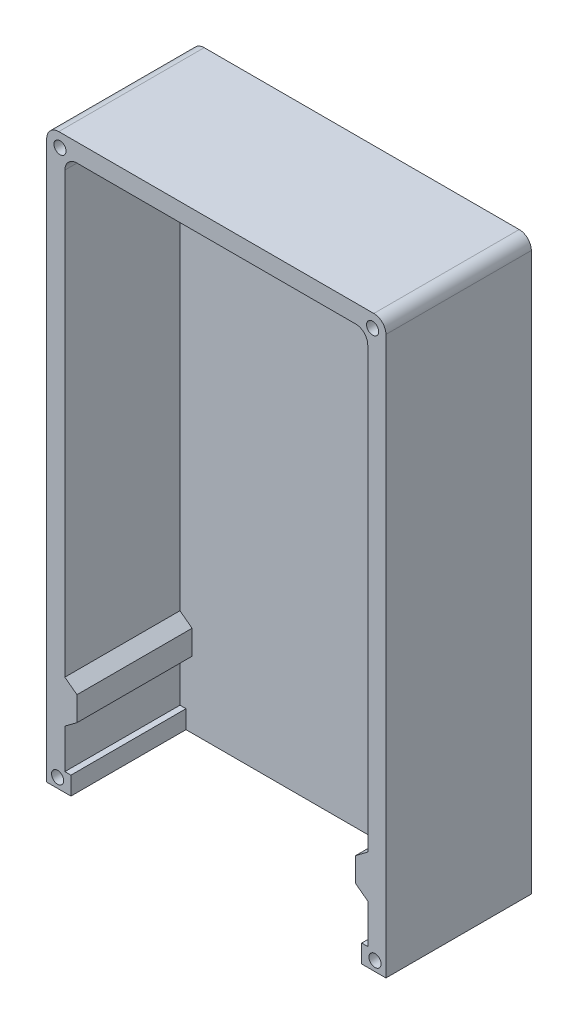
ISO-10303-21;
HEADER;
FILE_DESCRIPTION(('STEP AP214'),'2;1');
FILE_NAME('part.step','',(''),(''),'','','');
FILE_SCHEMA(('AUTOMOTIVE_DESIGN { 1 0 10303 214 1 1 1 1 }'));
ENDSEC;
DATA;
#1=APPLICATION_CONTEXT('core data for automotive mechanical design processes');
#2=APPLICATION_PROTOCOL_DEFINITION('international standard','automotive_design',2000,#1);
#3=PRODUCT_CONTEXT('',#1,'mechanical');
#4=PRODUCT('Part','Part','',(#3));
#5=PRODUCT_RELATED_PRODUCT_CATEGORY('part','',(#4));
#6=PRODUCT_DEFINITION_FORMATION('','',#4);
#7=PRODUCT_DEFINITION_CONTEXT('part definition',#1,'design');
#8=PRODUCT_DEFINITION('design','',#6,#7);
#9=PRODUCT_DEFINITION_SHAPE('','',#8);
#10=(LENGTH_UNIT() NAMED_UNIT(*) SI_UNIT(.MILLI.,.METRE.));
#11=(NAMED_UNIT(*) PLANE_ANGLE_UNIT() SI_UNIT($,.RADIAN.));
#12=(NAMED_UNIT(*) SI_UNIT($,.STERADIAN.) SOLID_ANGLE_UNIT());
#13=UNCERTAINTY_MEASURE_WITH_UNIT(LENGTH_MEASURE(1.E-05),#10,'distance_accuracy_value','');
#14=(GEOMETRIC_REPRESENTATION_CONTEXT(3) GLOBAL_UNCERTAINTY_ASSIGNED_CONTEXT((#13)) GLOBAL_UNIT_ASSIGNED_CONTEXT((#10,
#11,#12)) REPRESENTATION_CONTEXT('',''));
#15=CARTESIAN_POINT('',(0.,0.,0.));
#16=DIRECTION('',(0.,0.,1.));
#17=DIRECTION('',(1.,0.,0.));
#18=AXIS2_PLACEMENT_3D('',#15,#16,#17);
#19=CARTESIAN_POINT('',(28.,0.,12.));
#20=DIRECTION('',(0.,1.,0.));
#21=DIRECTION('',(-1.,0.,0.));
#22=AXIS2_PLACEMENT_3D('',#19,#20,#21);
#23=PLANE('',#22);
#24=DIRECTION('',(1.,0.,0.));
#25=VECTOR('',#24,1.);
#26=CARTESIAN_POINT('',(28.,0.,12.));
#27=LINE('',#26,#25);
#28=CARTESIAN_POINT('',(26.,0.,12.));
#29=VERTEX_POINT('',#28);
#30=CARTESIAN_POINT('',(28.,0.,12.));
#31=VERTEX_POINT('',#30);
#32=EDGE_CURVE('E356',#29,#31,#27,.T.);
#33=ORIENTED_EDGE('',*,*,#32,.F.);
#34=DIRECTION('',(0.,0.,1.));
#35=VECTOR('',#34,1.);
#36=CARTESIAN_POINT('',(26.,0.,2.5));
#37=LINE('',#36,#35);
#38=CARTESIAN_POINT('',(26.,0.,2.5));
#39=VERTEX_POINT('',#38);
#40=EDGE_CURVE('E322',#39,#29,#37,.T.);
#41=ORIENTED_EDGE('',*,*,#40,.F.);
#42=DIRECTION('',(1.,0.,0.));
#43=VECTOR('',#42,1.);
#44=CARTESIAN_POINT('',(2.,0.,2.5));
#45=LINE('',#44,#43);
#46=CARTESIAN_POINT('',(2.,0.,2.5));
#47=VERTEX_POINT('',#46);
#48=EDGE_CURVE('E267',#47,#39,#45,.T.);
#49=ORIENTED_EDGE('',*,*,#48,.F.);
#50=DIRECTION('',(0.,0.,1.));
#51=VECTOR('',#50,1.);
#52=CARTESIAN_POINT('',(2.,0.,2.5));
#53=LINE('',#52,#51);
#54=CARTESIAN_POINT('',(2.,0.,12.));
#55=VERTEX_POINT('',#54);
#56=EDGE_CURVE('E324',#47,#55,#53,.T.);
#57=ORIENTED_EDGE('',*,*,#56,.T.);
#58=CARTESIAN_POINT('',(0.,0.,12.));
#59=VERTEX_POINT('',#58);
#60=EDGE_CURVE('E352',#59,#55,#27,.T.);
#61=ORIENTED_EDGE('',*,*,#60,.F.);
#62=DIRECTION('',(0.,0.,-1.));
#63=VECTOR('',#62,1.);
#64=CARTESIAN_POINT('',(0.,0.,12.));
#65=LINE('',#64,#63);
#66=CARTESIAN_POINT('',(0.,0.,0.));
#67=VERTEX_POINT('',#66);
#68=EDGE_CURVE('E362',#59,#67,#65,.T.);
#69=ORIENTED_EDGE('',*,*,#68,.T.);
#70=DIRECTION('',(1.,0.,0.));
#71=VECTOR('',#70,1.);
#72=CARTESIAN_POINT('',(28.,0.,0.));
#73=LINE('',#72,#71);
#74=CARTESIAN_POINT('',(28.,0.,0.));
#75=VERTEX_POINT('',#74);
#76=EDGE_CURVE('E319',#67,#75,#73,.T.);
#77=ORIENTED_EDGE('',*,*,#76,.T.);
#78=DIRECTION('',(0.,0.,-1.));
#79=VECTOR('',#78,1.);
#80=CARTESIAN_POINT('',(28.,0.,12.));
#81=LINE('',#80,#79);
#82=EDGE_CURVE('E373',#31,#75,#81,.T.);
#83=ORIENTED_EDGE('',*,*,#82,.F.);
#84=EDGE_LOOP('',(#33,#41,#49,#57,#61,#69,#77,#83));
#85=FACE_BOUND('',#84,.T.);
#86=ADVANCED_FACE('F33',(#85),#23,.F.);
#87=CARTESIAN_POINT('',(28.,47.,12.));
#88=DIRECTION('',(-1.,0.,0.));
#89=DIRECTION('',(0.,-1.,0.));
#90=AXIS2_PLACEMENT_3D('',#87,#88,#89);
#91=PLANE('',#90);
#92=DIRECTION('',(0.,1.,0.));
#93=VECTOR('',#92,1.);
#94=CARTESIAN_POINT('',(28.,47.,0.));
#95=LINE('',#94,#93);
#96=CARTESIAN_POINT('',(28.,46.,0.));
#97=VERTEX_POINT('',#96);
#98=EDGE_CURVE('E365',#75,#97,#95,.T.);
#99=ORIENTED_EDGE('',*,*,#98,.T.);
#100=DIRECTION('',(0.,0.,-1.));
#101=VECTOR('',#100,1.);
#102=CARTESIAN_POINT('',(28.,46.,12.));
#103=LINE('',#102,#101);
#104=CARTESIAN_POINT('',(28.,46.,12.));
#105=VERTEX_POINT('',#104);
#106=EDGE_CURVE('E11',#97,#105,#103,.F.);
#107=ORIENTED_EDGE('',*,*,#106,.T.);
#108=DIRECTION('',(0.,1.,0.));
#109=VECTOR('',#108,1.);
#110=CARTESIAN_POINT('',(28.,47.,12.));
#111=LINE('',#110,#109);
#112=EDGE_CURVE('E355',#31,#105,#111,.T.);
#113=ORIENTED_EDGE('',*,*,#112,.F.);
#114=ORIENTED_EDGE('',*,*,#82,.T.);
#115=EDGE_LOOP('',(#99,#107,#113,#114));
#116=FACE_BOUND('',#115,.T.);
#117=ADVANCED_FACE('F408',(#116),#91,.F.);
#118=CARTESIAN_POINT('',(0.,47.,12.));
#119=DIRECTION('',(0.,-1.,0.));
#120=DIRECTION('',(0.,0.,-1.));
#121=AXIS2_PLACEMENT_3D('',#118,#119,#120);
#122=PLANE('',#121);
#123=DIRECTION('',(-1.,0.,0.));
#124=VECTOR('',#123,1.);
#125=CARTESIAN_POINT('',(0.,47.,0.));
#126=LINE('',#125,#124);
#127=CARTESIAN_POINT('',(27.,47.,0.));
#128=VERTEX_POINT('',#127);
#129=CARTESIAN_POINT('',(0.999999999999992,47.,0.));
#130=VERTEX_POINT('',#129);
#131=EDGE_CURVE('E367',#128,#130,#126,.T.);
#132=ORIENTED_EDGE('',*,*,#131,.T.);
#133=DIRECTION('',(0.,0.,-1.));
#134=VECTOR('',#133,1.);
#135=CARTESIAN_POINT('',(0.999999999999992,47.,12.));
#136=LINE('',#135,#134);
#137=CARTESIAN_POINT('',(0.999999999999992,47.,12.));
#138=VERTEX_POINT('',#137);
#139=EDGE_CURVE('E54',#130,#138,#136,.F.);
#140=ORIENTED_EDGE('',*,*,#139,.T.);
#141=DIRECTION('',(-1.,0.,0.));
#142=VECTOR('',#141,1.);
#143=CARTESIAN_POINT('',(0.,47.,12.));
#144=LINE('',#143,#142);
#145=CARTESIAN_POINT('',(27.,47.,12.));
#146=VERTEX_POINT('',#145);
#147=EDGE_CURVE('E358',#146,#138,#144,.T.);
#148=ORIENTED_EDGE('',*,*,#147,.F.);
#149=DIRECTION('',(0.,0.,-1.));
#150=VECTOR('',#149,1.);
#151=CARTESIAN_POINT('',(27.,47.,12.));
#152=LINE('',#151,#150);
#153=EDGE_CURVE('E383',#146,#128,#152,.T.);
#154=ORIENTED_EDGE('',*,*,#153,.T.);
#155=EDGE_LOOP('',(#132,#140,#148,#154));
#156=FACE_BOUND('',#155,.T.);
#157=ADVANCED_FACE('F404',(#156),#122,.F.);
#158=CARTESIAN_POINT('',(0.,0.,12.));
#159=DIRECTION('',(1.,0.,0.));
#160=DIRECTION('',(0.,1.,0.));
#161=AXIS2_PLACEMENT_3D('',#158,#159,#160);
#162=PLANE('',#161);
#163=DIRECTION('',(0.,-1.,0.));
#164=VECTOR('',#163,1.);
#165=CARTESIAN_POINT('',(0.,0.,12.));
#166=LINE('',#165,#164);
#167=CARTESIAN_POINT('',(0.,46.,12.));
#168=VERTEX_POINT('',#167);
#169=EDGE_CURVE('E360',#168,#59,#166,.T.);
#170=ORIENTED_EDGE('',*,*,#169,.F.);
#171=DIRECTION('',(0.,0.,-1.));
#172=VECTOR('',#171,1.);
#173=CARTESIAN_POINT('',(0.,46.,12.));
#174=LINE('',#173,#172);
#175=CARTESIAN_POINT('',(0.,46.,0.));
#176=VERTEX_POINT('',#175);
#177=EDGE_CURVE('E376',#168,#176,#174,.T.);
#178=ORIENTED_EDGE('',*,*,#177,.T.);
#179=DIRECTION('',(0.,-1.,0.));
#180=VECTOR('',#179,1.);
#181=CARTESIAN_POINT('',(0.,0.,0.));
#182=LINE('',#181,#180);
#183=EDGE_CURVE('E369',#176,#67,#182,.T.);
#184=ORIENTED_EDGE('',*,*,#183,.T.);
#185=ORIENTED_EDGE('',*,*,#68,.F.);
#186=EDGE_LOOP('',(#170,#178,#184,#185));
#187=FACE_BOUND('',#186,.T.);
#188=ADVANCED_FACE('F396',(#187),#162,.F.);
#189=CARTESIAN_POINT('',(0.,0.,12.));
#190=DIRECTION('',(0.,0.,-1.));
#191=DIRECTION('',(-1.,0.,0.));
#192=AXIS2_PLACEMENT_3D('',#189,#190,#191);
#193=PLANE('',#192);
#194=CARTESIAN_POINT('',(26.9,45.9,12.));
#195=DIRECTION('',(0.,0.,1.));
#196=DIRECTION('',(1.,0.,0.));
#197=AXIS2_PLACEMENT_3D('',#194,#195,#196);
#198=CIRCLE('',#197,0.500000000000003);
#199=CARTESIAN_POINT('',(27.4,45.9,12.));
#200=VERTEX_POINT('',#199);
#201=EDGE_CURVE('E545',#200,#200,#198,.T.);
#202=ORIENTED_EDGE('',*,*,#201,.F.);
#203=EDGE_LOOP('',(#202));
#204=FACE_BOUND('',#203,.T.);
#205=CARTESIAN_POINT('',(0.899999999999991,0.800000000000002,12.));
#206=DIRECTION('',(0.,0.,1.));
#207=DIRECTION('',(1.,0.,0.));
#208=AXIS2_PLACEMENT_3D('',#205,#206,#207);
#209=CIRCLE('',#208,0.5);
#210=CARTESIAN_POINT('',(1.39999999999999,0.800000000000002,12.));
#211=VERTEX_POINT('',#210);
#212=EDGE_CURVE('E533',#211,#211,#209,.T.);
#213=ORIENTED_EDGE('',*,*,#212,.F.);
#214=EDGE_LOOP('',(#213));
#215=FACE_BOUND('',#214,.T.);
#216=CARTESIAN_POINT('',(27.1,0.800000000000002,12.));
#217=DIRECTION('',(0.,0.,1.));
#218=DIRECTION('',(1.,0.,0.));
#219=AXIS2_PLACEMENT_3D('',#216,#217,#218);
#220=CIRCLE('',#219,0.500000000000003);
#221=CARTESIAN_POINT('',(27.6,0.800000000000002,12.));
#222=VERTEX_POINT('',#221);
#223=EDGE_CURVE('E534',#222,#222,#220,.T.);
#224=ORIENTED_EDGE('',*,*,#223,.F.);
#225=EDGE_LOOP('',(#224));
#226=FACE_BOUND('',#225,.T.);
#227=CARTESIAN_POINT('',(1.09999999999999,45.9,12.));
#228=DIRECTION('',(0.,0.,1.));
#229=DIRECTION('',(1.,0.,0.));
#230=AXIS2_PLACEMENT_3D('',#227,#228,#229);
#231=CIRCLE('',#230,0.5);
#232=CARTESIAN_POINT('',(1.59999999999999,45.9,12.));
#233=VERTEX_POINT('',#232);
#234=EDGE_CURVE('E227',#233,#233,#231,.T.);
#235=ORIENTED_EDGE('',*,*,#234,.F.);
#236=EDGE_LOOP('',(#235));
#237=FACE_BOUND('',#236,.T.);
#238=ORIENTED_EDGE('',*,*,#147,.T.);
#239=CARTESIAN_POINT('',(0.999999999999992,46.,12.));
#240=DIRECTION('',(0.,0.,-1.));
#241=DIRECTION('',(-1.,0.,0.));
#242=AXIS2_PLACEMENT_3D('',#239,#240,#241);
#243=CIRCLE('',#242,1.);
#244=EDGE_CURVE('E41',#138,#168,#243,.F.);
#245=ORIENTED_EDGE('',*,*,#244,.T.);
#246=ORIENTED_EDGE('',*,*,#169,.T.);
#247=ORIENTED_EDGE('',*,*,#60,.T.);
#248=DIRECTION('',(0.,-1.,0.));
#249=VECTOR('',#248,1.);
#250=CARTESIAN_POINT('',(2.,1.5,12.));
#251=LINE('',#250,#249);
#252=CARTESIAN_POINT('',(2.,1.5,12.));
#253=VERTEX_POINT('',#252);
#254=EDGE_CURVE('E313',#253,#55,#251,.T.);
#255=ORIENTED_EDGE('',*,*,#254,.F.);
#256=DIRECTION('',(1.,0.,0.));
#257=VECTOR('',#256,1.);
#258=CARTESIAN_POINT('',(1.49999999999999,1.5,12.));
#259=LINE('',#258,#257);
#260=CARTESIAN_POINT('',(1.49999999999999,1.5,12.));
#261=VERTEX_POINT('',#260);
#262=EDGE_CURVE('E310',#261,#253,#259,.T.);
#263=ORIENTED_EDGE('',*,*,#262,.F.);
#264=DIRECTION('',(0.,-1.,0.));
#265=VECTOR('',#264,1.);
#266=CARTESIAN_POINT('',(1.49999999999999,4.75190442107215,12.));
#267=LINE('',#266,#265);
#268=CARTESIAN_POINT('',(1.49999999999999,4.75190442107215,12.));
#269=VERTEX_POINT('',#268);
#270=EDGE_CURVE('E307',#269,#261,#267,.T.);
#271=ORIENTED_EDGE('',*,*,#270,.F.);
#272=DIRECTION('',(-0.800731370948735,-0.599023598515584,0.));
#273=VECTOR('',#272,1.);
#274=CARTESIAN_POINT('',(2.49999999999999,5.5,12.));
#275=LINE('',#274,#273);
#276=CARTESIAN_POINT('',(2.49999999999999,5.5,12.));
#277=VERTEX_POINT('',#276);
#278=EDGE_CURVE('E304',#277,#269,#275,.T.);
#279=ORIENTED_EDGE('',*,*,#278,.F.);
#280=DIRECTION('',(0.,-1.,0.));
#281=VECTOR('',#280,1.);
#282=CARTESIAN_POINT('',(2.49999999999999,7.5,12.));
#283=LINE('',#282,#281);
#284=CARTESIAN_POINT('',(2.49999999999999,7.5,12.));
#285=VERTEX_POINT('',#284);
#286=EDGE_CURVE('E301',#285,#277,#283,.T.);
#287=ORIENTED_EDGE('',*,*,#286,.F.);
#288=DIRECTION('',(0.79926877760228,-0.600973727504088,0.));
#289=VECTOR('',#288,1.);
#290=CARTESIAN_POINT('',(1.49999999999999,8.25190442107215,12.));
#291=LINE('',#290,#289);
#292=CARTESIAN_POINT('',(1.49999999999999,8.25190442107215,12.));
#293=VERTEX_POINT('',#292);
#294=EDGE_CURVE('E298',#293,#285,#291,.T.);
#295=ORIENTED_EDGE('',*,*,#294,.F.);
#296=DIRECTION('',(0.,-1.,0.));
#297=VECTOR('',#296,1.);
#298=CARTESIAN_POINT('',(1.49999999999999,44.5,12.));
#299=LINE('',#298,#297);
#300=CARTESIAN_POINT('',(1.49999999999999,44.5,12.));
#301=VERTEX_POINT('',#300);
#302=EDGE_CURVE('E295',#301,#293,#299,.T.);
#303=ORIENTED_EDGE('',*,*,#302,.F.);
#304=CARTESIAN_POINT('',(2.49999999999999,44.5,12.));
#305=DIRECTION('',(0.,0.,1.));
#306=DIRECTION('',(1.,0.,0.));
#307=AXIS2_PLACEMENT_3D('',#304,#305,#306);
#308=CIRCLE('',#307,1.);
#309=CARTESIAN_POINT('',(2.5,45.5,12.));
#310=VERTEX_POINT('',#309);
#311=EDGE_CURVE('E292',#310,#301,#308,.T.);
#312=ORIENTED_EDGE('',*,*,#311,.F.);
#313=DIRECTION('',(-1.,0.,0.));
#314=VECTOR('',#313,1.);
#315=CARTESIAN_POINT('',(2.5,45.5,12.));
#316=LINE('',#315,#314);
#317=CARTESIAN_POINT('',(25.5,45.5,12.));
#318=VERTEX_POINT('',#317);
#319=EDGE_CURVE('E289',#318,#310,#316,.T.);
#320=ORIENTED_EDGE('',*,*,#319,.F.);
#321=CARTESIAN_POINT('',(25.5,44.5,12.));
#322=DIRECTION('',(0.,0.,1.));
#323=DIRECTION('',(-1.,0.,0.));
#324=AXIS2_PLACEMENT_3D('',#321,#322,#323);
#325=CIRCLE('',#324,1.);
#326=CARTESIAN_POINT('',(26.5,44.5,12.));
#327=VERTEX_POINT('',#326);
#328=EDGE_CURVE('E286',#327,#318,#325,.T.);
#329=ORIENTED_EDGE('',*,*,#328,.F.);
#330=DIRECTION('',(0.,1.,0.));
#331=VECTOR('',#330,1.);
#332=CARTESIAN_POINT('',(26.5,44.5,12.));
#333=LINE('',#332,#331);
#334=CARTESIAN_POINT('',(26.5,8.25190442107215,12.));
#335=VERTEX_POINT('',#334);
#336=EDGE_CURVE('E283',#335,#327,#333,.T.);
#337=ORIENTED_EDGE('',*,*,#336,.F.);
#338=DIRECTION('',(0.79926877760228,0.600973727504088,0.));
#339=VECTOR('',#338,1.);
#340=CARTESIAN_POINT('',(26.5,8.25190442107215,12.));
#341=LINE('',#340,#339);
#342=CARTESIAN_POINT('',(25.5,7.5,12.));
#343=VERTEX_POINT('',#342);
#344=EDGE_CURVE('E280',#343,#335,#341,.T.);
#345=ORIENTED_EDGE('',*,*,#344,.F.);
#346=DIRECTION('',(0.,1.,0.));
#347=VECTOR('',#346,1.);
#348=CARTESIAN_POINT('',(25.5,7.5,12.));
#349=LINE('',#348,#347);
#350=CARTESIAN_POINT('',(25.5,5.5,12.));
#351=VERTEX_POINT('',#350);
#352=EDGE_CURVE('E277',#351,#343,#349,.T.);
#353=ORIENTED_EDGE('',*,*,#352,.F.);
#354=DIRECTION('',(-0.800731370948735,0.599023598515584,0.));
#355=VECTOR('',#354,1.);
#356=CARTESIAN_POINT('',(25.5,5.5,12.));
#357=LINE('',#356,#355);
#358=CARTESIAN_POINT('',(26.5,4.75190442107215,12.));
#359=VERTEX_POINT('',#358);
#360=EDGE_CURVE('E274',#359,#351,#357,.T.);
#361=ORIENTED_EDGE('',*,*,#360,.F.);
#362=DIRECTION('',(0.,1.,0.));
#363=VECTOR('',#362,1.);
#364=CARTESIAN_POINT('',(26.5,4.75190442107215,12.));
#365=LINE('',#364,#363);
#366=CARTESIAN_POINT('',(26.5,1.5,12.));
#367=VERTEX_POINT('',#366);
#368=EDGE_CURVE('E203',#367,#359,#365,.T.);
#369=ORIENTED_EDGE('',*,*,#368,.F.);
#370=DIRECTION('',(1.,0.,0.));
#371=VECTOR('',#370,1.);
#372=CARTESIAN_POINT('',(26.,1.5,12.));
#373=LINE('',#372,#371);
#374=CARTESIAN_POINT('',(26.,1.5,12.));
#375=VERTEX_POINT('',#374);
#376=EDGE_CURVE('E221',#375,#367,#373,.T.);
#377=ORIENTED_EDGE('',*,*,#376,.F.);
#378=DIRECTION('',(0.,1.,0.));
#379=VECTOR('',#378,1.);
#380=CARTESIAN_POINT('',(26.,1.5,12.));
#381=LINE('',#380,#379);
#382=EDGE_CURVE('E224',#29,#375,#381,.T.);
#383=ORIENTED_EDGE('',*,*,#382,.F.);
#384=ORIENTED_EDGE('',*,*,#32,.T.);
#385=ORIENTED_EDGE('',*,*,#112,.T.);
#386=CARTESIAN_POINT('',(27.,46.,12.));
#387=DIRECTION('',(0.,0.,-1.));
#388=DIRECTION('',(-1.,0.,0.));
#389=AXIS2_PLACEMENT_3D('',#386,#387,#388);
#390=CIRCLE('',#389,1.);
#391=EDGE_CURVE('E387',#105,#146,#390,.F.);
#392=ORIENTED_EDGE('',*,*,#391,.T.);
#393=EDGE_LOOP('',(#238,#245,#246,#247,#255,#263,#271,#279,#287,#295,#303,#312,#320,#329,#337,
#345,#353,#361,#369,#377,#383,#384,#385,#392));
#394=FACE_BOUND('',#393,.T.);
#395=ADVANCED_FACE('F391',(#204,#215,#226,#237,#394),#193,.F.);
#396=CARTESIAN_POINT('',(0.,0.,0.));
#397=DIRECTION('',(0.,0.,-1.));
#398=DIRECTION('',(-1.,0.,0.));
#399=AXIS2_PLACEMENT_3D('',#396,#397,#398);
#400=PLANE('',#399);
#401=ORIENTED_EDGE('',*,*,#183,.F.);
#402=CARTESIAN_POINT('',(0.999999999999992,46.,0.));
#403=DIRECTION('',(0.,0.,-1.));
#404=DIRECTION('',(-1.,0.,0.));
#405=AXIS2_PLACEMENT_3D('',#402,#403,#404);
#406=CIRCLE('',#405,1.);
#407=EDGE_CURVE('E381',#176,#130,#406,.T.);
#408=ORIENTED_EDGE('',*,*,#407,.T.);
#409=ORIENTED_EDGE('',*,*,#131,.F.);
#410=CARTESIAN_POINT('',(27.,46.,0.));
#411=DIRECTION('',(0.,0.,-1.));
#412=DIRECTION('',(-1.,0.,0.));
#413=AXIS2_PLACEMENT_3D('',#410,#411,#412);
#414=CIRCLE('',#413,1.);
#415=EDGE_CURVE('E379',#128,#97,#414,.T.);
#416=ORIENTED_EDGE('',*,*,#415,.T.);
#417=ORIENTED_EDGE('',*,*,#98,.F.);
#418=ORIENTED_EDGE('',*,*,#76,.F.);
#419=EDGE_LOOP('',(#401,#408,#409,#416,#417,#418));
#420=FACE_BOUND('',#419,.T.);
#421=ADVANCED_FACE('F402',(#420),#400,.T.);
#422=CARTESIAN_POINT('',(26.5,4.75190442107215,2.5));
#423=DIRECTION('',(1.,0.,0.));
#424=DIRECTION('',(0.,1.,0.));
#425=AXIS2_PLACEMENT_3D('',#422,#423,#424);
#426=PLANE('',#425);
#427=ORIENTED_EDGE('',*,*,#368,.T.);
#428=DIRECTION('',(0.,0.,1.));
#429=VECTOR('',#428,1.);
#430=CARTESIAN_POINT('',(26.5,4.75190442107215,2.5));
#431=LINE('',#430,#429);
#432=CARTESIAN_POINT('',(26.5,4.75190442107215,2.5));
#433=VERTEX_POINT('',#432);
#434=EDGE_CURVE('E196',#433,#359,#431,.T.);
#435=ORIENTED_EDGE('',*,*,#434,.F.);
#436=DIRECTION('',(0.,1.,0.));
#437=VECTOR('',#436,1.);
#438=CARTESIAN_POINT('',(26.5,4.75190442107215,2.5));
#439=LINE('',#438,#437);
#440=CARTESIAN_POINT('',(26.5,1.5,2.5));
#441=VERTEX_POINT('',#440);
#442=EDGE_CURVE('E200',#441,#433,#439,.T.);
#443=ORIENTED_EDGE('',*,*,#442,.F.);
#444=DIRECTION('',(0.,0.,1.));
#445=VECTOR('',#444,1.);
#446=CARTESIAN_POINT('',(26.5,1.5,2.5));
#447=LINE('',#446,#445);
#448=EDGE_CURVE('E317',#441,#367,#447,.T.);
#449=ORIENTED_EDGE('',*,*,#448,.T.);
#450=EDGE_LOOP('',(#427,#435,#443,#449));
#451=FACE_BOUND('',#450,.T.);
#452=ADVANCED_FACE('F198',(#451),#426,.F.);
#453=CARTESIAN_POINT('',(26.,1.5,2.5));
#454=DIRECTION('',(0.,-1.,0.));
#455=DIRECTION('',(1.,0.,0.));
#456=AXIS2_PLACEMENT_3D('',#453,#454,#455);
#457=PLANE('',#456);
#458=ORIENTED_EDGE('',*,*,#376,.T.);
#459=ORIENTED_EDGE('',*,*,#448,.F.);
#460=DIRECTION('',(1.,0.,0.));
#461=VECTOR('',#460,1.);
#462=CARTESIAN_POINT('',(26.,1.5,2.5));
#463=LINE('',#462,#461);
#464=CARTESIAN_POINT('',(26.,1.5,2.5));
#465=VERTEX_POINT('',#464);
#466=EDGE_CURVE('E208',#465,#441,#463,.T.);
#467=ORIENTED_EDGE('',*,*,#466,.F.);
#468=DIRECTION('',(0.,0.,1.));
#469=VECTOR('',#468,1.);
#470=CARTESIAN_POINT('',(26.,1.5,2.5));
#471=LINE('',#470,#469);
#472=EDGE_CURVE('E320',#465,#375,#471,.T.);
#473=ORIENTED_EDGE('',*,*,#472,.T.);
#474=EDGE_LOOP('',(#458,#459,#467,#473));
#475=FACE_BOUND('',#474,.T.);
#476=ADVANCED_FACE('F470',(#475),#457,.F.);
#477=CARTESIAN_POINT('',(26.,1.5,2.5));
#478=DIRECTION('',(1.,0.,0.));
#479=DIRECTION('',(0.,0.,-1.));
#480=AXIS2_PLACEMENT_3D('',#477,#478,#479);
#481=PLANE('',#480);
#482=ORIENTED_EDGE('',*,*,#382,.T.);
#483=ORIENTED_EDGE('',*,*,#472,.F.);
#484=DIRECTION('',(0.,1.,0.));
#485=VECTOR('',#484,1.);
#486=CARTESIAN_POINT('',(26.,1.5,2.5));
#487=LINE('',#486,#485);
#488=EDGE_CURVE('E270',#39,#465,#487,.T.);
#489=ORIENTED_EDGE('',*,*,#488,.F.);
#490=ORIENTED_EDGE('',*,*,#40,.T.);
#491=EDGE_LOOP('',(#482,#483,#489,#490));
#492=FACE_BOUND('',#491,.T.);
#493=ADVANCED_FACE('F467',(#492),#481,.F.);
#494=CARTESIAN_POINT('',(2.,1.5,2.5));
#495=DIRECTION('',(-1.,0.,0.));
#496=DIRECTION('',(0.,0.,1.));
#497=AXIS2_PLACEMENT_3D('',#494,#495,#496);
#498=PLANE('',#497);
#499=ORIENTED_EDGE('',*,*,#254,.T.);
#500=ORIENTED_EDGE('',*,*,#56,.F.);
#501=DIRECTION('',(0.,-1.,0.));
#502=VECTOR('',#501,1.);
#503=CARTESIAN_POINT('',(2.,1.5,2.5));
#504=LINE('',#503,#502);
#505=CARTESIAN_POINT('',(2.,1.5,2.5));
#506=VERTEX_POINT('',#505);
#507=EDGE_CURVE('E264',#506,#47,#504,.T.);
#508=ORIENTED_EDGE('',*,*,#507,.F.);
#509=DIRECTION('',(0.,0.,1.));
#510=VECTOR('',#509,1.);
#511=CARTESIAN_POINT('',(2.,1.5,2.5));
#512=LINE('',#511,#510);
#513=EDGE_CURVE('E327',#506,#253,#512,.T.);
#514=ORIENTED_EDGE('',*,*,#513,.T.);
#515=EDGE_LOOP('',(#499,#500,#508,#514));
#516=FACE_BOUND('',#515,.T.);
#517=ADVANCED_FACE('F417',(#516),#498,.F.);
#518=CARTESIAN_POINT('',(1.49999999999999,1.5,2.5));
#519=DIRECTION('',(0.,-1.,0.));
#520=DIRECTION('',(0.,0.,-1.));
#521=AXIS2_PLACEMENT_3D('',#518,#519,#520);
#522=PLANE('',#521);
#523=ORIENTED_EDGE('',*,*,#262,.T.);
#524=ORIENTED_EDGE('',*,*,#513,.F.);
#525=DIRECTION('',(1.,0.,0.));
#526=VECTOR('',#525,1.);
#527=CARTESIAN_POINT('',(1.49999999999999,1.5,2.5));
#528=LINE('',#527,#526);
#529=CARTESIAN_POINT('',(1.49999999999999,1.5,2.5));
#530=VERTEX_POINT('',#529);
#531=EDGE_CURVE('E261',#530,#506,#528,.T.);
#532=ORIENTED_EDGE('',*,*,#531,.F.);
#533=DIRECTION('',(0.,0.,1.));
#534=VECTOR('',#533,1.);
#535=CARTESIAN_POINT('',(1.49999999999999,1.5,2.5));
#536=LINE('',#535,#534);
#537=EDGE_CURVE('E329',#530,#261,#536,.T.);
#538=ORIENTED_EDGE('',*,*,#537,.T.);
#539=EDGE_LOOP('',(#523,#524,#532,#538));
#540=FACE_BOUND('',#539,.T.);
#541=ADVANCED_FACE('F421',(#540),#522,.F.);
#542=CARTESIAN_POINT('',(1.49999999999999,4.75190442107215,2.5));
#543=DIRECTION('',(-1.,0.,0.));
#544=DIRECTION('',(0.,-1.,0.));
#545=AXIS2_PLACEMENT_3D('',#542,#543,#544);
#546=PLANE('',#545);
#547=ORIENTED_EDGE('',*,*,#270,.T.);
#548=ORIENTED_EDGE('',*,*,#537,.F.);
#549=DIRECTION('',(0.,-1.,0.));
#550=VECTOR('',#549,1.);
#551=CARTESIAN_POINT('',(1.49999999999999,4.75190442107215,2.5));
#552=LINE('',#551,#550);
#553=CARTESIAN_POINT('',(1.49999999999999,4.75190442107215,2.5));
#554=VERTEX_POINT('',#553);
#555=EDGE_CURVE('E258',#554,#530,#552,.T.);
#556=ORIENTED_EDGE('',*,*,#555,.F.);
#557=DIRECTION('',(0.,0.,1.));
#558=VECTOR('',#557,1.);
#559=CARTESIAN_POINT('',(1.49999999999999,4.75190442107215,2.5));
#560=LINE('',#559,#558);
#561=EDGE_CURVE('E331',#554,#269,#560,.T.);
#562=ORIENTED_EDGE('',*,*,#561,.T.);
#563=EDGE_LOOP('',(#547,#548,#556,#562));
#564=FACE_BOUND('',#563,.T.);
#565=ADVANCED_FACE('F424',(#564),#546,.F.);
#566=CARTESIAN_POINT('',(2.49999999999999,5.5,2.5));
#567=DIRECTION('',(-0.599023598515584,0.800731370948735,0.));
#568=DIRECTION('',(-0.800731370948735,-0.599023598515584,0.));
#569=AXIS2_PLACEMENT_3D('',#566,#567,#568);
#570=PLANE('',#569);
#571=ORIENTED_EDGE('',*,*,#278,.T.);
#572=ORIENTED_EDGE('',*,*,#561,.F.);
#573=DIRECTION('',(-0.800731370948735,-0.599023598515584,0.));
#574=VECTOR('',#573,1.);
#575=CARTESIAN_POINT('',(2.49999999999999,5.5,2.5));
#576=LINE('',#575,#574);
#577=CARTESIAN_POINT('',(2.49999999999999,5.5,2.5));
#578=VERTEX_POINT('',#577);
#579=EDGE_CURVE('E255',#578,#554,#576,.T.);
#580=ORIENTED_EDGE('',*,*,#579,.F.);
#581=DIRECTION('',(0.,0.,1.));
#582=VECTOR('',#581,1.);
#583=CARTESIAN_POINT('',(2.49999999999999,5.5,2.5));
#584=LINE('',#583,#582);
#585=EDGE_CURVE('E333',#578,#277,#584,.T.);
#586=ORIENTED_EDGE('',*,*,#585,.T.);
#587=EDGE_LOOP('',(#571,#572,#580,#586));
#588=FACE_BOUND('',#587,.T.);
#589=ADVANCED_FACE('F429',(#588),#570,.F.);
#590=CARTESIAN_POINT('',(2.49999999999999,7.5,2.5));
#591=DIRECTION('',(-1.,0.,0.));
#592=DIRECTION('',(0.,0.,1.));
#593=AXIS2_PLACEMENT_3D('',#590,#591,#592);
#594=PLANE('',#593);
#595=ORIENTED_EDGE('',*,*,#286,.T.);
#596=ORIENTED_EDGE('',*,*,#585,.F.);
#597=DIRECTION('',(0.,-1.,0.));
#598=VECTOR('',#597,1.);
#599=CARTESIAN_POINT('',(2.49999999999999,7.5,2.5));
#600=LINE('',#599,#598);
#601=CARTESIAN_POINT('',(2.49999999999999,7.5,2.5));
#602=VERTEX_POINT('',#601);
#603=EDGE_CURVE('E252',#602,#578,#600,.T.);
#604=ORIENTED_EDGE('',*,*,#603,.F.);
#605=DIRECTION('',(0.,0.,1.));
#606=VECTOR('',#605,1.);
#607=CARTESIAN_POINT('',(2.49999999999999,7.5,2.5));
#608=LINE('',#607,#606);
#609=EDGE_CURVE('E335',#602,#285,#608,.T.);
#610=ORIENTED_EDGE('',*,*,#609,.T.);
#611=EDGE_LOOP('',(#595,#596,#604,#610));
#612=FACE_BOUND('',#611,.T.);
#613=ADVANCED_FACE('F433',(#612),#594,.F.);
#614=CARTESIAN_POINT('',(1.49999999999999,8.25190442107215,2.5));
#615=DIRECTION('',(-0.600973727504088,-0.79926877760228,0.));
#616=DIRECTION('',(0.79926877760228,-0.600973727504088,0.));
#617=AXIS2_PLACEMENT_3D('',#614,#615,#616);
#618=PLANE('',#617);
#619=ORIENTED_EDGE('',*,*,#294,.T.);
#620=ORIENTED_EDGE('',*,*,#609,.F.);
#621=DIRECTION('',(0.79926877760228,-0.600973727504088,0.));
#622=VECTOR('',#621,1.);
#623=CARTESIAN_POINT('',(1.49999999999999,8.25190442107215,2.5));
#624=LINE('',#623,#622);
#625=CARTESIAN_POINT('',(1.49999999999999,8.25190442107215,2.5));
#626=VERTEX_POINT('',#625);
#627=EDGE_CURVE('E249',#626,#602,#624,.T.);
#628=ORIENTED_EDGE('',*,*,#627,.F.);
#629=DIRECTION('',(0.,0.,1.));
#630=VECTOR('',#629,1.);
#631=CARTESIAN_POINT('',(1.49999999999999,8.25190442107215,2.5));
#632=LINE('',#631,#630);
#633=EDGE_CURVE('E337',#626,#293,#632,.T.);
#634=ORIENTED_EDGE('',*,*,#633,.T.);
#635=EDGE_LOOP('',(#619,#620,#628,#634));
#636=FACE_BOUND('',#635,.T.);
#637=ADVANCED_FACE('F436',(#636),#618,.F.);
#638=CARTESIAN_POINT('',(1.49999999999999,44.5,2.5));
#639=DIRECTION('',(-1.,0.,0.));
#640=DIRECTION('',(0.,-1.,0.));
#641=AXIS2_PLACEMENT_3D('',#638,#639,#640);
#642=PLANE('',#641);
#643=ORIENTED_EDGE('',*,*,#302,.T.);
#644=ORIENTED_EDGE('',*,*,#633,.F.);
#645=DIRECTION('',(0.,-1.,0.));
#646=VECTOR('',#645,1.);
#647=CARTESIAN_POINT('',(1.49999999999999,44.5,2.5));
#648=LINE('',#647,#646);
#649=CARTESIAN_POINT('',(1.49999999999999,44.5,2.5));
#650=VERTEX_POINT('',#649);
#651=EDGE_CURVE('E246',#650,#626,#648,.T.);
#652=ORIENTED_EDGE('',*,*,#651,.F.);
#653=DIRECTION('',(0.,0.,1.));
#654=VECTOR('',#653,1.);
#655=CARTESIAN_POINT('',(1.49999999999999,44.5,2.5));
#656=LINE('',#655,#654);
#657=EDGE_CURVE('E339',#650,#301,#656,.T.);
#658=ORIENTED_EDGE('',*,*,#657,.T.);
#659=EDGE_LOOP('',(#643,#644,#652,#658));
#660=FACE_BOUND('',#659,.T.);
#661=ADVANCED_FACE('F441',(#660),#642,.F.);
#662=CARTESIAN_POINT('',(2.49999999999999,44.5,2.5));
#663=DIRECTION('',(0.,0.,1.));
#664=DIRECTION('',(1.,0.,0.));
#665=AXIS2_PLACEMENT_3D('',#662,#663,#664);
#666=CYLINDRICAL_SURFACE('',#665,1.);
#667=ORIENTED_EDGE('',*,*,#311,.T.);
#668=ORIENTED_EDGE('',*,*,#657,.F.);
#669=CARTESIAN_POINT('',(2.49999999999999,44.5,2.5));
#670=DIRECTION('',(0.,0.,1.));
#671=DIRECTION('',(1.,0.,0.));
#672=AXIS2_PLACEMENT_3D('',#669,#670,#671);
#673=CIRCLE('',#672,1.);
#674=CARTESIAN_POINT('',(2.5,45.5,2.5));
#675=VERTEX_POINT('',#674);
#676=EDGE_CURVE('E243',#675,#650,#673,.T.);
#677=ORIENTED_EDGE('',*,*,#676,.F.);
#678=DIRECTION('',(0.,0.,1.));
#679=VECTOR('',#678,1.);
#680=CARTESIAN_POINT('',(2.5,45.5,2.5));
#681=LINE('',#680,#679);
#682=EDGE_CURVE('E341',#675,#310,#681,.T.);
#683=ORIENTED_EDGE('',*,*,#682,.T.);
#684=EDGE_LOOP('',(#667,#668,#677,#683));
#685=FACE_BOUND('',#684,.T.);
#686=ADVANCED_FACE('F445',(#685),#666,.F.);
#687=CARTESIAN_POINT('',(2.5,45.5,2.5));
#688=DIRECTION('',(0.,1.,0.));
#689=DIRECTION('',(0.,0.,1.));
#690=AXIS2_PLACEMENT_3D('',#687,#688,#689);
#691=PLANE('',#690);
#692=ORIENTED_EDGE('',*,*,#319,.T.);
#693=ORIENTED_EDGE('',*,*,#682,.F.);
#694=DIRECTION('',(-1.,0.,0.));
#695=VECTOR('',#694,1.);
#696=CARTESIAN_POINT('',(2.5,45.5,2.5));
#697=LINE('',#696,#695);
#698=CARTESIAN_POINT('',(25.5,45.5,2.5));
#699=VERTEX_POINT('',#698);
#700=EDGE_CURVE('E240',#699,#675,#697,.T.);
#701=ORIENTED_EDGE('',*,*,#700,.F.);
#702=DIRECTION('',(0.,0.,1.));
#703=VECTOR('',#702,1.);
#704=CARTESIAN_POINT('',(25.5,45.5,2.5));
#705=LINE('',#704,#703);
#706=EDGE_CURVE('E343',#699,#318,#705,.T.);
#707=ORIENTED_EDGE('',*,*,#706,.T.);
#708=EDGE_LOOP('',(#692,#693,#701,#707));
#709=FACE_BOUND('',#708,.T.);
#710=ADVANCED_FACE('F448',(#709),#691,.F.);
#711=CARTESIAN_POINT('',(25.5,44.5,2.5));
#712=DIRECTION('',(0.,0.,1.));
#713=DIRECTION('',(1.,0.,0.));
#714=AXIS2_PLACEMENT_3D('',#711,#712,#713);
#715=CYLINDRICAL_SURFACE('',#714,1.);
#716=ORIENTED_EDGE('',*,*,#328,.T.);
#717=ORIENTED_EDGE('',*,*,#706,.F.);
#718=CARTESIAN_POINT('',(25.5,44.5,2.5));
#719=DIRECTION('',(0.,0.,1.));
#720=DIRECTION('',(-1.,0.,0.));
#721=AXIS2_PLACEMENT_3D('',#718,#719,#720);
#722=CIRCLE('',#721,1.);
#723=CARTESIAN_POINT('',(26.5,44.5,2.5));
#724=VERTEX_POINT('',#723);
#725=EDGE_CURVE('E237',#724,#699,#722,.T.);
#726=ORIENTED_EDGE('',*,*,#725,.F.);
#727=DIRECTION('',(0.,0.,1.));
#728=VECTOR('',#727,1.);
#729=CARTESIAN_POINT('',(26.5,44.5,2.5));
#730=LINE('',#729,#728);
#731=EDGE_CURVE('E345',#724,#327,#730,.T.);
#732=ORIENTED_EDGE('',*,*,#731,.T.);
#733=EDGE_LOOP('',(#716,#717,#726,#732));
#734=FACE_BOUND('',#733,.T.);
#735=ADVANCED_FACE('F453',(#734),#715,.F.);
#736=CARTESIAN_POINT('',(26.5,44.5,2.5));
#737=DIRECTION('',(1.,0.,0.));
#738=DIRECTION('',(0.,1.,0.));
#739=AXIS2_PLACEMENT_3D('',#736,#737,#738);
#740=PLANE('',#739);
#741=ORIENTED_EDGE('',*,*,#336,.T.);
#742=ORIENTED_EDGE('',*,*,#731,.F.);
#743=DIRECTION('',(0.,1.,0.));
#744=VECTOR('',#743,1.);
#745=CARTESIAN_POINT('',(26.5,44.5,2.5));
#746=LINE('',#745,#744);
#747=CARTESIAN_POINT('',(26.5,8.25190442107215,2.5));
#748=VERTEX_POINT('',#747);
#749=EDGE_CURVE('E234',#748,#724,#746,.T.);
#750=ORIENTED_EDGE('',*,*,#749,.F.);
#751=DIRECTION('',(0.,0.,1.));
#752=VECTOR('',#751,1.);
#753=CARTESIAN_POINT('',(26.5,8.25190442107215,2.5));
#754=LINE('',#753,#752);
#755=EDGE_CURVE('E347',#748,#335,#754,.T.);
#756=ORIENTED_EDGE('',*,*,#755,.T.);
#757=EDGE_LOOP('',(#741,#742,#750,#756));
#758=FACE_BOUND('',#757,.T.);
#759=ADVANCED_FACE('F457',(#758),#740,.F.);
#760=CARTESIAN_POINT('',(26.5,8.25190442107215,2.5));
#761=DIRECTION('',(0.600973727504088,-0.79926877760228,0.));
#762=DIRECTION('',(0.79926877760228,0.600973727504088,0.));
#763=AXIS2_PLACEMENT_3D('',#760,#761,#762);
#764=PLANE('',#763);
#765=ORIENTED_EDGE('',*,*,#344,.T.);
#766=ORIENTED_EDGE('',*,*,#755,.F.);
#767=DIRECTION('',(0.79926877760228,0.600973727504088,0.));
#768=VECTOR('',#767,1.);
#769=CARTESIAN_POINT('',(26.5,8.25190442107215,2.5));
#770=LINE('',#769,#768);
#771=CARTESIAN_POINT('',(25.5,7.5,2.5));
#772=VERTEX_POINT('',#771);
#773=EDGE_CURVE('E231',#772,#748,#770,.T.);
#774=ORIENTED_EDGE('',*,*,#773,.F.);
#775=DIRECTION('',(0.,0.,1.));
#776=VECTOR('',#775,1.);
#777=CARTESIAN_POINT('',(25.5,7.5,2.5));
#778=LINE('',#777,#776);
#779=EDGE_CURVE('E349',#772,#343,#778,.T.);
#780=ORIENTED_EDGE('',*,*,#779,.T.);
#781=EDGE_LOOP('',(#765,#766,#774,#780));
#782=FACE_BOUND('',#781,.T.);
#783=ADVANCED_FACE('F460',(#782),#764,.F.);
#784=CARTESIAN_POINT('',(25.5,7.5,2.5));
#785=DIRECTION('',(1.,0.,0.));
#786=DIRECTION('',(0.,0.,-1.));
#787=AXIS2_PLACEMENT_3D('',#784,#785,#786);
#788=PLANE('',#787);
#789=ORIENTED_EDGE('',*,*,#352,.T.);
#790=ORIENTED_EDGE('',*,*,#779,.F.);
#791=DIRECTION('',(0.,1.,0.));
#792=VECTOR('',#791,1.);
#793=CARTESIAN_POINT('',(25.5,7.5,2.5));
#794=LINE('',#793,#792);
#795=CARTESIAN_POINT('',(25.5,5.5,2.5));
#796=VERTEX_POINT('',#795);
#797=EDGE_CURVE('E216',#796,#772,#794,.T.);
#798=ORIENTED_EDGE('',*,*,#797,.F.);
#799=DIRECTION('',(0.,0.,1.));
#800=VECTOR('',#799,1.);
#801=CARTESIAN_POINT('',(25.5,5.5,2.5));
#802=LINE('',#801,#800);
#803=EDGE_CURVE('E207',#796,#351,#802,.T.);
#804=ORIENTED_EDGE('',*,*,#803,.T.);
#805=EDGE_LOOP('',(#789,#790,#798,#804));
#806=FACE_BOUND('',#805,.T.);
#807=ADVANCED_FACE('F463',(#806),#788,.F.);
#808=CARTESIAN_POINT('',(25.5,5.5,2.5));
#809=DIRECTION('',(0.599023598515584,0.800731370948735,0.));
#810=DIRECTION('',(-0.800731370948735,0.599023598515584,0.));
#811=AXIS2_PLACEMENT_3D('',#808,#809,#810);
#812=PLANE('',#811);
#813=ORIENTED_EDGE('',*,*,#360,.T.);
#814=ORIENTED_EDGE('',*,*,#803,.F.);
#815=DIRECTION('',(-0.800731370948735,0.599023598515584,0.));
#816=VECTOR('',#815,1.);
#817=CARTESIAN_POINT('',(25.5,5.5,2.5));
#818=LINE('',#817,#816);
#819=EDGE_CURVE('E211',#433,#796,#818,.T.);
#820=ORIENTED_EDGE('',*,*,#819,.F.);
#821=ORIENTED_EDGE('',*,*,#434,.T.);
#822=EDGE_LOOP('',(#813,#814,#820,#821));
#823=FACE_BOUND('',#822,.T.);
#824=ADVANCED_FACE('F212',(#823),#812,.F.);
#825=CARTESIAN_POINT('',(2.49999999999999,44.5,2.5));
#826=DIRECTION('',(0.,0.,1.));
#827=DIRECTION('',(1.,0.,0.));
#828=AXIS2_PLACEMENT_3D('',#825,#826,#827);
#829=PLANE('',#828);
#830=ORIENTED_EDGE('',*,*,#442,.T.);
#831=ORIENTED_EDGE('',*,*,#819,.T.);
#832=ORIENTED_EDGE('',*,*,#797,.T.);
#833=ORIENTED_EDGE('',*,*,#773,.T.);
#834=ORIENTED_EDGE('',*,*,#749,.T.);
#835=ORIENTED_EDGE('',*,*,#725,.T.);
#836=ORIENTED_EDGE('',*,*,#700,.T.);
#837=ORIENTED_EDGE('',*,*,#676,.T.);
#838=ORIENTED_EDGE('',*,*,#651,.T.);
#839=ORIENTED_EDGE('',*,*,#627,.T.);
#840=ORIENTED_EDGE('',*,*,#603,.T.);
#841=ORIENTED_EDGE('',*,*,#579,.T.);
#842=ORIENTED_EDGE('',*,*,#555,.T.);
#843=ORIENTED_EDGE('',*,*,#531,.T.);
#844=ORIENTED_EDGE('',*,*,#507,.T.);
#845=ORIENTED_EDGE('',*,*,#48,.T.);
#846=ORIENTED_EDGE('',*,*,#488,.T.);
#847=ORIENTED_EDGE('',*,*,#466,.T.);
#848=EDGE_LOOP('',(#830,#831,#832,#833,#834,#835,#836,#837,#838,#839,#840,#841,#842,#843,#844,
#845,#846,#847));
#849=FACE_BOUND('',#848,.T.);
#850=ADVANCED_FACE('F218',(#849),#829,.T.);
#851=CARTESIAN_POINT('',(0.999999999999992,46.,12.));
#852=DIRECTION('',(0.,0.,-1.));
#853=DIRECTION('',(-1.,0.,0.));
#854=AXIS2_PLACEMENT_3D('',#851,#852,#853);
#855=CYLINDRICAL_SURFACE('',#854,1.);
#856=ORIENTED_EDGE('',*,*,#244,.F.);
#857=ORIENTED_EDGE('',*,*,#139,.F.);
#858=ORIENTED_EDGE('',*,*,#407,.F.);
#859=ORIENTED_EDGE('',*,*,#177,.F.);
#860=EDGE_LOOP('',(#856,#857,#858,#859));
#861=FACE_BOUND('',#860,.T.);
#862=ADVANCED_FACE('F399',(#861),#855,.T.);
#863=CARTESIAN_POINT('',(27.,46.,12.));
#864=DIRECTION('',(0.,0.,-1.));
#865=DIRECTION('',(-1.,0.,0.));
#866=AXIS2_PLACEMENT_3D('',#863,#864,#865);
#867=CYLINDRICAL_SURFACE('',#866,1.);
#868=ORIENTED_EDGE('',*,*,#391,.F.);
#869=ORIENTED_EDGE('',*,*,#106,.F.);
#870=ORIENTED_EDGE('',*,*,#415,.F.);
#871=ORIENTED_EDGE('',*,*,#153,.F.);
#872=EDGE_LOOP('',(#868,#869,#870,#871));
#873=FACE_BOUND('',#872,.T.);
#874=ADVANCED_FACE('F35',(#873),#867,.T.);
#875=CARTESIAN_POINT('',(1.09999999999999,45.9,9.));
#876=DIRECTION('',(0.,0.,1.));
#877=DIRECTION('',(1.,0.,0.));
#878=AXIS2_PLACEMENT_3D('',#875,#876,#877);
#879=CYLINDRICAL_SURFACE('',#878,0.5);
#880=CARTESIAN_POINT('',(1.09999999999999,45.9,9.));
#881=DIRECTION('',(0.,0.,1.));
#882=DIRECTION('',(1.,0.,0.));
#883=AXIS2_PLACEMENT_3D('',#880,#881,#882);
#884=CIRCLE('',#883,0.5);
#885=CARTESIAN_POINT('',(1.59999999999999,45.9,9.));
#886=VERTEX_POINT('',#885);
#887=EDGE_CURVE('E275',#886,#886,#884,.T.);
#888=ORIENTED_EDGE('',*,*,#887,.F.);
#889=EDGE_LOOP('',(#888));
#890=FACE_BOUND('',#889,.T.);
#891=ORIENTED_EDGE('',*,*,#234,.T.);
#892=EDGE_LOOP('',(#891));
#893=FACE_BOUND('',#892,.T.);
#894=ADVANCED_FACE('F492',(#890,#893),#879,.F.);
#895=CARTESIAN_POINT('',(1.09999999999999,45.9,9.));
#896=DIRECTION('',(0.,0.,1.));
#897=DIRECTION('',(1.,0.,0.));
#898=AXIS2_PLACEMENT_3D('',#895,#896,#897);
#899=PLANE('',#898);
#900=ORIENTED_EDGE('',*,*,#887,.T.);
#901=EDGE_LOOP('',(#900));
#902=FACE_BOUND('',#901,.T.);
#903=ADVANCED_FACE('F500',(#902),#899,.T.);
#904=CARTESIAN_POINT('',(27.1,0.800000000000002,9.));
#905=DIRECTION('',(0.,0.,1.));
#906=DIRECTION('',(1.,0.,0.));
#907=AXIS2_PLACEMENT_3D('',#904,#905,#906);
#908=CYLINDRICAL_SURFACE('',#907,0.500000000000003);
#909=CARTESIAN_POINT('',(27.1,0.800000000000002,9.));
#910=DIRECTION('',(0.,0.,1.));
#911=DIRECTION('',(1.,0.,0.));
#912=AXIS2_PLACEMENT_3D('',#909,#910,#911);
#913=CIRCLE('',#912,0.500000000000003);
#914=CARTESIAN_POINT('',(27.6,0.800000000000002,9.));
#915=VERTEX_POINT('',#914);
#916=EDGE_CURVE('E532',#915,#915,#913,.T.);
#917=ORIENTED_EDGE('',*,*,#916,.F.);
#918=EDGE_LOOP('',(#917));
#919=FACE_BOUND('',#918,.T.);
#920=ORIENTED_EDGE('',*,*,#223,.T.);
#921=EDGE_LOOP('',(#920));
#922=FACE_BOUND('',#921,.T.);
#923=ADVANCED_FACE('F504',(#919,#922),#908,.F.);
#924=CARTESIAN_POINT('',(27.1,0.800000000000002,9.));
#925=DIRECTION('',(0.,0.,1.));
#926=DIRECTION('',(1.,0.,0.));
#927=AXIS2_PLACEMENT_3D('',#924,#925,#926);
#928=PLANE('',#927);
#929=ORIENTED_EDGE('',*,*,#916,.T.);
#930=EDGE_LOOP('',(#929));
#931=FACE_BOUND('',#930,.T.);
#932=ADVANCED_FACE('F510',(#931),#928,.T.);
#933=CARTESIAN_POINT('',(0.899999999999991,0.800000000000002,9.));
#934=DIRECTION('',(0.,0.,1.));
#935=DIRECTION('',(1.,0.,0.));
#936=AXIS2_PLACEMENT_3D('',#933,#934,#935);
#937=CYLINDRICAL_SURFACE('',#936,0.5);
#938=CARTESIAN_POINT('',(0.899999999999991,0.800000000000002,9.));
#939=DIRECTION('',(0.,0.,1.));
#940=DIRECTION('',(1.,0.,0.));
#941=AXIS2_PLACEMENT_3D('',#938,#939,#940);
#942=CIRCLE('',#941,0.5);
#943=CARTESIAN_POINT('',(1.39999999999999,0.800000000000002,9.));
#944=VERTEX_POINT('',#943);
#945=EDGE_CURVE('E537',#944,#944,#942,.T.);
#946=ORIENTED_EDGE('',*,*,#945,.F.);
#947=EDGE_LOOP('',(#946));
#948=FACE_BOUND('',#947,.T.);
#949=ORIENTED_EDGE('',*,*,#212,.T.);
#950=EDGE_LOOP('',(#949));
#951=FACE_BOUND('',#950,.T.);
#952=ADVANCED_FACE('F506',(#948,#951),#937,.F.);
#953=CARTESIAN_POINT('',(0.899999999999991,0.800000000000002,9.));
#954=DIRECTION('',(0.,0.,1.));
#955=DIRECTION('',(1.,0.,0.));
#956=AXIS2_PLACEMENT_3D('',#953,#954,#955);
#957=PLANE('',#956);
#958=ORIENTED_EDGE('',*,*,#945,.T.);
#959=EDGE_LOOP('',(#958));
#960=FACE_BOUND('',#959,.T.);
#961=ADVANCED_FACE('F509',(#960),#957,.T.);
#962=CARTESIAN_POINT('',(26.9,45.9,9.));
#963=DIRECTION('',(0.,0.,1.));
#964=DIRECTION('',(1.,0.,0.));
#965=AXIS2_PLACEMENT_3D('',#962,#963,#964);
#966=CYLINDRICAL_SURFACE('',#965,0.500000000000003);
#967=CARTESIAN_POINT('',(26.9,45.9,9.));
#968=DIRECTION('',(0.,0.,1.));
#969=DIRECTION('',(1.,0.,0.));
#970=AXIS2_PLACEMENT_3D('',#967,#968,#969);
#971=CIRCLE('',#970,0.500000000000003);
#972=CARTESIAN_POINT('',(27.4,45.9,9.));
#973=VERTEX_POINT('',#972);
#974=EDGE_CURVE('E542',#973,#973,#971,.T.);
#975=ORIENTED_EDGE('',*,*,#974,.F.);
#976=EDGE_LOOP('',(#975));
#977=FACE_BOUND('',#976,.T.);
#978=ORIENTED_EDGE('',*,*,#201,.T.);
#979=EDGE_LOOP('',(#978));
#980=FACE_BOUND('',#979,.T.);
#981=ADVANCED_FACE('F514',(#977,#980),#966,.F.);
#982=CARTESIAN_POINT('',(26.9,45.9,9.));
#983=DIRECTION('',(0.,0.,1.));
#984=DIRECTION('',(1.,0.,0.));
#985=AXIS2_PLACEMENT_3D('',#982,#983,#984);
#986=PLANE('',#985);
#987=ORIENTED_EDGE('',*,*,#974,.T.);
#988=EDGE_LOOP('',(#987));
#989=FACE_BOUND('',#988,.T.);
#990=ADVANCED_FACE('F518',(#989),#986,.T.);
#991=CLOSED_SHELL('',(#86,#117,#157,#188,#395,#421,#452,#476,#493,#517,#541,#565,#589,#613,#637,
#661,#686,#710,#735,#759,#783,#807,#824,#850,#862,#874,#894,#903,#923,#932,#952,#961,#981,#990));
#992=MANIFOLD_SOLID_BREP('B2',#991);
#993=ADVANCED_BREP_SHAPE_REPRESENTATION('',(#18,#992),#14);
#994=SHAPE_DEFINITION_REPRESENTATION(#9,#993);
ENDSEC;
END-ISO-10303-21;
